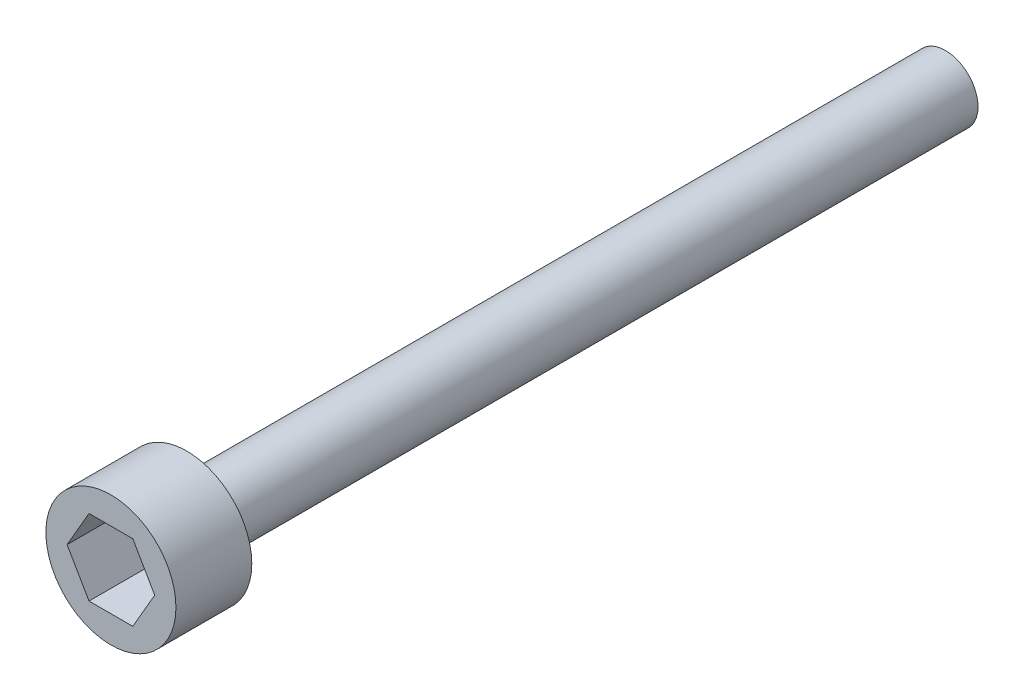
ISO-10303-21;
HEADER;
FILE_DESCRIPTION(('STEP AP214'),'2;1');
FILE_NAME('part.step','',(''),(''),'','','');
FILE_SCHEMA(('AUTOMOTIVE_DESIGN { 1 0 10303 214 1 1 1 1 }'));
ENDSEC;
DATA;
#1=APPLICATION_CONTEXT('core data for automotive mechanical design processes');
#2=APPLICATION_PROTOCOL_DEFINITION('international standard','automotive_design',2000,#1);
#3=PRODUCT_CONTEXT('',#1,'mechanical');
#4=PRODUCT('Part','Part','',(#3));
#5=PRODUCT_RELATED_PRODUCT_CATEGORY('part','',(#4));
#6=PRODUCT_DEFINITION_FORMATION('','',#4);
#7=PRODUCT_DEFINITION_CONTEXT('part definition',#1,'design');
#8=PRODUCT_DEFINITION('design','',#6,#7);
#9=PRODUCT_DEFINITION_SHAPE('','',#8);
#10=(LENGTH_UNIT() NAMED_UNIT(*) SI_UNIT(.MILLI.,.METRE.));
#11=(NAMED_UNIT(*) PLANE_ANGLE_UNIT() SI_UNIT($,.RADIAN.));
#12=(NAMED_UNIT(*) SI_UNIT($,.STERADIAN.) SOLID_ANGLE_UNIT());
#13=UNCERTAINTY_MEASURE_WITH_UNIT(LENGTH_MEASURE(1.E-05),#10,'distance_accuracy_value','');
#14=(GEOMETRIC_REPRESENTATION_CONTEXT(3) GLOBAL_UNCERTAINTY_ASSIGNED_CONTEXT((#13)) GLOBAL_UNIT_ASSIGNED_CONTEXT((#10,
#11,#12)) REPRESENTATION_CONTEXT('',''));
#15=CARTESIAN_POINT('',(0.,0.,0.));
#16=DIRECTION('',(0.,0.,1.));
#17=DIRECTION('',(1.,0.,0.));
#18=AXIS2_PLACEMENT_3D('',#15,#16,#17);
#19=CARTESIAN_POINT('',(0.,0.,3.5));
#20=DIRECTION('',(0.,0.,-1.));
#21=DIRECTION('',(-1.,0.,0.));
#22=AXIS2_PLACEMENT_3D('',#19,#20,#21);
#23=CYLINDRICAL_SURFACE('',#22,3.);
#24=CARTESIAN_POINT('',(0.,0.,3.5));
#25=DIRECTION('',(0.,0.,1.));
#26=DIRECTION('',(1.,0.,0.));
#27=AXIS2_PLACEMENT_3D('',#24,#25,#26);
#28=CIRCLE('',#27,3.);
#29=CARTESIAN_POINT('',(3.,0.,3.5));
#30=VERTEX_POINT('',#29);
#31=EDGE_CURVE('E11',#30,#30,#28,.T.);
#32=ORIENTED_EDGE('',*,*,#31,.F.);
#33=EDGE_LOOP('',(#32));
#34=FACE_BOUND('',#33,.T.);
#35=CARTESIAN_POINT('',(0.,0.,0.));
#36=DIRECTION('',(0.,0.,1.));
#37=DIRECTION('',(1.,0.,0.));
#38=AXIS2_PLACEMENT_3D('',#35,#36,#37);
#39=CIRCLE('',#38,3.);
#40=CARTESIAN_POINT('',(3.,0.,0.));
#41=VERTEX_POINT('',#40);
#42=EDGE_CURVE('E33',#41,#41,#39,.T.);
#43=ORIENTED_EDGE('',*,*,#42,.T.);
#44=EDGE_LOOP('',(#43));
#45=FACE_BOUND('',#44,.T.);
#46=ADVANCED_FACE('F30',(#34,#45),#23,.T.);
#47=CARTESIAN_POINT('',(0.,0.,3.5));
#48=DIRECTION('',(0.,0.,1.));
#49=DIRECTION('',(1.,0.,0.));
#50=AXIS2_PLACEMENT_3D('',#47,#48,#49);
#51=PLANE('',#50);
#52=DIRECTION('',(-0.499999999999528,-0.866025403784711,0.));
#53=VECTOR('',#52,1.);
#54=CARTESIAN_POINT('',(-2.02072594216261,2.1557411053031E-12,3.5));
#55=LINE('',#54,#53);
#56=CARTESIAN_POINT('',(-1.01036297108294,1.75000000000058,3.5));
#57=VERTEX_POINT('',#56);
#58=CARTESIAN_POINT('',(-2.02072594216261,2.15561075933568E-12,3.5));
#59=VERTEX_POINT('',#58);
#60=EDGE_CURVE('E44',#57,#59,#55,.T.);
#61=ORIENTED_EDGE('',*,*,#60,.F.);
#62=DIRECTION('',(-1.,-7.11024037944377E-13,0.));
#63=VECTOR('',#62,1.);
#64=CARTESIAN_POINT('',(-1.01036297108294,1.75000000000058,3.5));
#65=LINE('',#64,#63);
#66=CARTESIAN_POINT('',(1.01036297108301,1.75000000000202,3.5));
#67=VERTEX_POINT('',#66);
#68=EDGE_CURVE('E128',#67,#57,#65,.T.);
#69=ORIENTED_EDGE('',*,*,#68,.F.);
#70=DIRECTION('',(-0.50000000000043,0.86602540378419,0.));
#71=VECTOR('',#70,1.);
#72=CARTESIAN_POINT('',(1.01036297108301,1.75000000000202,3.5));
#73=LINE('',#72,#71);
#74=CARTESIAN_POINT('',(2.02072594216593,2.15574110530311E-12,3.5));
#75=VERTEX_POINT('',#74);
#76=EDGE_CURVE('E126',#75,#67,#73,.T.);
#77=ORIENTED_EDGE('',*,*,#76,.F.);
#78=DIRECTION('',(0.499999999999527,0.866025403784711,0.));
#79=VECTOR('',#78,1.);
#80=CARTESIAN_POINT('',(2.02072594216593,2.15574110530311E-12,3.5));
#81=LINE('',#80,#79);
#82=CARTESIAN_POINT('',(1.01036297108301,-1.75000000000192,3.5));
#83=VERTEX_POINT('',#82);
#84=EDGE_CURVE('E92',#83,#75,#81,.T.);
#85=ORIENTED_EDGE('',*,*,#84,.F.);
#86=DIRECTION('',(1.,7.11024037946673E-13,0.));
#87=VECTOR('',#86,1.);
#88=CARTESIAN_POINT('',(1.01036297108301,-1.75000000000192,3.5));
#89=LINE('',#88,#87);
#90=CARTESIAN_POINT('',(-1.01036297107642,-1.75000000000336,3.5));
#91=VERTEX_POINT('',#90);
#92=EDGE_CURVE('E122',#91,#83,#89,.T.);
#93=ORIENTED_EDGE('',*,*,#92,.F.);
#94=DIRECTION('',(0.500000000000431,-0.86602540378419,0.));
#95=VECTOR('',#94,1.);
#96=CARTESIAN_POINT('',(-1.01036297107642,-1.75000000000336,3.5));
#97=LINE('',#96,#95);
#98=EDGE_CURVE('E118',#59,#91,#97,.T.);
#99=ORIENTED_EDGE('',*,*,#98,.F.);
#100=EDGE_LOOP('',(#61,#69,#77,#85,#93,#99));
#101=FACE_BOUND('',#100,.T.);
#102=ORIENTED_EDGE('',*,*,#31,.T.);
#103=EDGE_LOOP('',(#102));
#104=FACE_BOUND('',#103,.T.);
#105=ADVANCED_FACE('F141',(#101,#104),#51,.T.);
#106=CARTESIAN_POINT('',(0.,0.,0.));
#107=DIRECTION('',(0.,0.,1.));
#108=DIRECTION('',(1.,0.,0.));
#109=AXIS2_PLACEMENT_3D('',#106,#107,#108);
#110=PLANE('',#109);
#111=CARTESIAN_POINT('',(0.,0.,0.));
#112=DIRECTION('',(0.,0.,1.));
#113=DIRECTION('',(1.,0.,0.));
#114=AXIS2_PLACEMENT_3D('',#111,#112,#113);
#115=CIRCLE('',#114,1.5);
#116=CARTESIAN_POINT('',(1.5,0.,0.));
#117=VERTEX_POINT('',#116);
#118=EDGE_CURVE('E148',#117,#117,#115,.T.);
#119=ORIENTED_EDGE('',*,*,#118,.T.);
#120=EDGE_LOOP('',(#119));
#121=FACE_BOUND('',#120,.T.);
#122=ORIENTED_EDGE('',*,*,#42,.F.);
#123=EDGE_LOOP('',(#122));
#124=FACE_BOUND('',#123,.T.);
#125=ADVANCED_FACE('F169',(#121,#124),#110,.F.);
#126=CARTESIAN_POINT('',(-2.02072594216261,2.1557411053031E-12,0.7));
#127=DIRECTION('',(-0.866025403784711,0.499999999999528,0.));
#128=DIRECTION('',(-0.499999999999528,-0.866025403784711,0.));
#129=AXIS2_PLACEMENT_3D('',#126,#127,#128);
#130=PLANE('',#129);
#131=ORIENTED_EDGE('',*,*,#60,.T.);
#132=DIRECTION('',(0.,0.,1.));
#133=VECTOR('',#132,1.);
#134=CARTESIAN_POINT('',(-2.02072594216261,2.1557411053031E-12,0.7));
#135=LINE('',#134,#133);
#136=CARTESIAN_POINT('',(-2.02072594216261,2.1557411053031E-12,0.7));
#137=VERTEX_POINT('',#136);
#138=EDGE_CURVE('E74',#137,#59,#135,.T.);
#139=ORIENTED_EDGE('',*,*,#138,.F.);
#140=DIRECTION('',(-0.499999999999528,-0.866025403784711,0.));
#141=VECTOR('',#140,1.);
#142=CARTESIAN_POINT('',(-2.02072594216261,2.1557411053031E-12,0.7));
#143=LINE('',#142,#141);
#144=CARTESIAN_POINT('',(-1.01036297108294,1.75000000000058,0.7));
#145=VERTEX_POINT('',#144);
#146=EDGE_CURVE('E130',#145,#137,#143,.T.);
#147=ORIENTED_EDGE('',*,*,#146,.F.);
#148=DIRECTION('',(0.,0.,1.));
#149=VECTOR('',#148,1.);
#150=CARTESIAN_POINT('',(-1.01036297108294,1.75000000000058,0.7));
#151=LINE('',#150,#149);
#152=EDGE_CURVE('E52',#145,#57,#151,.T.);
#153=ORIENTED_EDGE('',*,*,#152,.T.);
#154=EDGE_LOOP('',(#131,#139,#147,#153));
#155=FACE_BOUND('',#154,.T.);
#156=ADVANCED_FACE('F177',(#155),#130,.F.);
#157=CARTESIAN_POINT('',(-1.01036297108294,1.75000000000058,0.7));
#158=DIRECTION('',(-7.11024037944377E-13,1.,0.));
#159=DIRECTION('',(-1.,-7.11024037944377E-13,0.));
#160=AXIS2_PLACEMENT_3D('',#157,#158,#159);
#161=PLANE('',#160);
#162=ORIENTED_EDGE('',*,*,#68,.T.);
#163=ORIENTED_EDGE('',*,*,#152,.F.);
#164=DIRECTION('',(-1.,-7.11024037944377E-13,0.));
#165=VECTOR('',#164,1.);
#166=CARTESIAN_POINT('',(-1.01036297108294,1.75000000000058,0.7));
#167=LINE('',#166,#165);
#168=CARTESIAN_POINT('',(1.01036297108301,1.75000000000202,0.7));
#169=VERTEX_POINT('',#168);
#170=EDGE_CURVE('E104',#169,#145,#167,.T.);
#171=ORIENTED_EDGE('',*,*,#170,.F.);
#172=DIRECTION('',(0.,0.,1.));
#173=VECTOR('',#172,1.);
#174=CARTESIAN_POINT('',(1.01036297108301,1.75000000000202,0.7));
#175=LINE('',#174,#173);
#176=EDGE_CURVE('E96',#169,#67,#175,.T.);
#177=ORIENTED_EDGE('',*,*,#176,.T.);
#178=EDGE_LOOP('',(#162,#163,#171,#177));
#179=FACE_BOUND('',#178,.T.);
#180=ADVANCED_FACE('F182',(#179),#161,.F.);
#181=CARTESIAN_POINT('',(1.01036297108301,1.75000000000202,0.7));
#182=DIRECTION('',(0.86602540378419,0.50000000000043,0.));
#183=DIRECTION('',(-0.50000000000043,0.86602540378419,0.));
#184=AXIS2_PLACEMENT_3D('',#181,#182,#183);
#185=PLANE('',#184);
#186=ORIENTED_EDGE('',*,*,#76,.T.);
#187=ORIENTED_EDGE('',*,*,#176,.F.);
#188=DIRECTION('',(-0.50000000000043,0.86602540378419,0.));
#189=VECTOR('',#188,1.);
#190=CARTESIAN_POINT('',(1.01036297108301,1.75000000000202,0.7));
#191=LINE('',#190,#189);
#192=CARTESIAN_POINT('',(2.02072594216593,2.15574110530311E-12,0.7));
#193=VERTEX_POINT('',#192);
#194=EDGE_CURVE('E100',#193,#169,#191,.T.);
#195=ORIENTED_EDGE('',*,*,#194,.F.);
#196=DIRECTION('',(0.,0.,1.));
#197=VECTOR('',#196,1.);
#198=CARTESIAN_POINT('',(2.02072594216593,2.15574110530311E-12,0.7));
#199=LINE('',#198,#197);
#200=EDGE_CURVE('E85',#193,#75,#199,.T.);
#201=ORIENTED_EDGE('',*,*,#200,.T.);
#202=EDGE_LOOP('',(#186,#187,#195,#201));
#203=FACE_BOUND('',#202,.T.);
#204=ADVANCED_FACE('F101',(#203),#185,.F.);
#205=CARTESIAN_POINT('',(2.02072594216593,2.15574110530311E-12,0.7));
#206=DIRECTION('',(0.866025403784712,-0.499999999999527,0.));
#207=DIRECTION('',(0.499999999999527,0.866025403784712,0.));
#208=AXIS2_PLACEMENT_3D('',#205,#206,#207);
#209=PLANE('',#208);
#210=ORIENTED_EDGE('',*,*,#84,.T.);
#211=ORIENTED_EDGE('',*,*,#200,.F.);
#212=DIRECTION('',(0.499999999999527,0.866025403784711,0.));
#213=VECTOR('',#212,1.);
#214=CARTESIAN_POINT('',(2.02072594216593,2.15574110530311E-12,0.7));
#215=LINE('',#214,#213);
#216=CARTESIAN_POINT('',(1.01036297108301,-1.75000000000192,0.7));
#217=VERTEX_POINT('',#216);
#218=EDGE_CURVE('E89',#217,#193,#215,.T.);
#219=ORIENTED_EDGE('',*,*,#218,.F.);
#220=DIRECTION('',(0.,0.,1.));
#221=VECTOR('',#220,1.);
#222=CARTESIAN_POINT('',(1.01036297108301,-1.75000000000192,0.7));
#223=LINE('',#222,#221);
#224=EDGE_CURVE('E97',#217,#83,#223,.T.);
#225=ORIENTED_EDGE('',*,*,#224,.T.);
#226=EDGE_LOOP('',(#210,#211,#219,#225));
#227=FACE_BOUND('',#226,.T.);
#228=ADVANCED_FACE('F87',(#227),#209,.F.);
#229=CARTESIAN_POINT('',(1.01036297108301,-1.75000000000192,0.7));
#230=DIRECTION('',(7.11024037946673E-13,-1.,0.));
#231=DIRECTION('',(1.,7.11024037946673E-13,0.));
#232=AXIS2_PLACEMENT_3D('',#229,#230,#231);
#233=PLANE('',#232);
#234=ORIENTED_EDGE('',*,*,#92,.T.);
#235=ORIENTED_EDGE('',*,*,#224,.F.);
#236=DIRECTION('',(1.,7.11024037946673E-13,0.));
#237=VECTOR('',#236,1.);
#238=CARTESIAN_POINT('',(1.01036297108301,-1.75000000000192,0.7));
#239=LINE('',#238,#237);
#240=CARTESIAN_POINT('',(-1.01036297107642,-1.75000000000336,0.7));
#241=VERTEX_POINT('',#240);
#242=EDGE_CURVE('E110',#241,#217,#239,.T.);
#243=ORIENTED_EDGE('',*,*,#242,.F.);
#244=DIRECTION('',(0.,0.,1.));
#245=VECTOR('',#244,1.);
#246=CARTESIAN_POINT('',(-1.01036297107642,-1.75000000000336,0.7));
#247=LINE('',#246,#245);
#248=EDGE_CURVE('E134',#241,#91,#247,.T.);
#249=ORIENTED_EDGE('',*,*,#248,.T.);
#250=EDGE_LOOP('',(#234,#235,#243,#249));
#251=FACE_BOUND('',#250,.T.);
#252=ADVANCED_FACE('F145',(#251),#233,.F.);
#253=CARTESIAN_POINT('',(-1.01036297107642,-1.75000000000336,0.7));
#254=DIRECTION('',(-0.86602540378419,-0.500000000000431,0.));
#255=DIRECTION('',(0.500000000000431,-0.86602540378419,0.));
#256=AXIS2_PLACEMENT_3D('',#253,#254,#255);
#257=PLANE('',#256);
#258=ORIENTED_EDGE('',*,*,#98,.T.);
#259=ORIENTED_EDGE('',*,*,#248,.F.);
#260=DIRECTION('',(0.500000000000431,-0.86602540378419,0.));
#261=VECTOR('',#260,1.);
#262=CARTESIAN_POINT('',(-1.01036297107642,-1.75000000000336,0.7));
#263=LINE('',#262,#261);
#264=EDGE_CURVE('E112',#137,#241,#263,.T.);
#265=ORIENTED_EDGE('',*,*,#264,.F.);
#266=ORIENTED_EDGE('',*,*,#138,.T.);
#267=EDGE_LOOP('',(#258,#259,#265,#266));
#268=FACE_BOUND('',#267,.T.);
#269=ADVANCED_FACE('F138',(#268),#257,.F.);
#270=CARTESIAN_POINT('',(-1.01036297108294,1.75000000000058,0.7));
#271=DIRECTION('',(0.,0.,-1.));
#272=DIRECTION('',(-1.,0.,0.));
#273=AXIS2_PLACEMENT_3D('',#270,#271,#272);
#274=PLANE('',#273);
#275=ORIENTED_EDGE('',*,*,#146,.T.);
#276=ORIENTED_EDGE('',*,*,#264,.T.);
#277=ORIENTED_EDGE('',*,*,#242,.T.);
#278=ORIENTED_EDGE('',*,*,#218,.T.);
#279=ORIENTED_EDGE('',*,*,#194,.T.);
#280=ORIENTED_EDGE('',*,*,#170,.T.);
#281=EDGE_LOOP('',(#275,#276,#277,#278,#279,#280));
#282=FACE_BOUND('',#281,.T.);
#283=ADVANCED_FACE('F107',(#282),#274,.F.);
#284=CARTESIAN_POINT('',(0.,0.,-35.));
#285=DIRECTION('',(0.,0.,1.));
#286=DIRECTION('',(1.,0.,0.));
#287=AXIS2_PLACEMENT_3D('',#284,#285,#286);
#288=CYLINDRICAL_SURFACE('',#287,1.5);
#289=CARTESIAN_POINT('',(0.,0.,-35.));
#290=DIRECTION('',(0.,0.,1.));
#291=DIRECTION('',(1.,0.,0.));
#292=AXIS2_PLACEMENT_3D('',#289,#290,#291);
#293=CIRCLE('',#292,1.5);
#294=CARTESIAN_POINT('',(1.5,0.,-35.));
#295=VERTEX_POINT('',#294);
#296=EDGE_CURVE('E119',#295,#295,#293,.T.);
#297=ORIENTED_EDGE('',*,*,#296,.T.);
#298=EDGE_LOOP('',(#297));
#299=FACE_BOUND('',#298,.T.);
#300=ORIENTED_EDGE('',*,*,#118,.F.);
#301=EDGE_LOOP('',(#300));
#302=FACE_BOUND('',#301,.T.);
#303=ADVANCED_FACE('F154',(#299,#302),#288,.T.);
#304=CARTESIAN_POINT('',(0.,0.,-35.));
#305=DIRECTION('',(0.,0.,1.));
#306=DIRECTION('',(1.,0.,0.));
#307=AXIS2_PLACEMENT_3D('',#304,#305,#306);
#308=PLANE('',#307);
#309=ORIENTED_EDGE('',*,*,#296,.F.);
#310=EDGE_LOOP('',(#309));
#311=FACE_BOUND('',#310,.T.);
#312=ADVANCED_FACE('F157',(#311),#308,.F.);
#313=CLOSED_SHELL('',(#46,#105,#125,#156,#180,#204,#228,#252,#269,#283,#303,#312));
#314=MANIFOLD_SOLID_BREP('B2',#313);
#315=ADVANCED_BREP_SHAPE_REPRESENTATION('',(#18,#314),#14);
#316=SHAPE_DEFINITION_REPRESENTATION(#9,#315);
ENDSEC;
END-ISO-10303-21;
